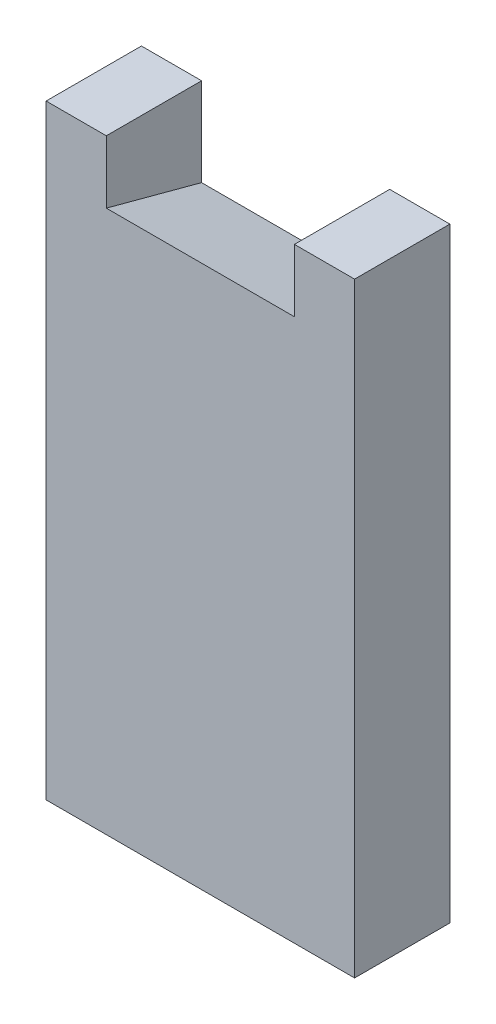
ISO-10303-21;
HEADER;
FILE_DESCRIPTION(('STEP AP214'),'2;1');
FILE_NAME('part.step','',(''),(''),'','','');
FILE_SCHEMA(('AUTOMOTIVE_DESIGN { 1 0 10303 214 1 1 1 1 }'));
ENDSEC;
DATA;
#1=APPLICATION_CONTEXT('core data for automotive mechanical design processes');
#2=APPLICATION_PROTOCOL_DEFINITION('international standard','automotive_design',2000,#1);
#3=PRODUCT_CONTEXT('',#1,'mechanical');
#4=PRODUCT('Part','Part','',(#3));
#5=PRODUCT_RELATED_PRODUCT_CATEGORY('part','',(#4));
#6=PRODUCT_DEFINITION_FORMATION('','',#4);
#7=PRODUCT_DEFINITION_CONTEXT('part definition',#1,'design');
#8=PRODUCT_DEFINITION('design','',#6,#7);
#9=PRODUCT_DEFINITION_SHAPE('','',#8);
#10=(LENGTH_UNIT() NAMED_UNIT(*) SI_UNIT(.MILLI.,.METRE.));
#11=(NAMED_UNIT(*) PLANE_ANGLE_UNIT() SI_UNIT($,.RADIAN.));
#12=(NAMED_UNIT(*) SI_UNIT($,.STERADIAN.) SOLID_ANGLE_UNIT());
#13=UNCERTAINTY_MEASURE_WITH_UNIT(LENGTH_MEASURE(1.E-05),#10,'distance_accuracy_value','');
#14=(GEOMETRIC_REPRESENTATION_CONTEXT(3) GLOBAL_UNCERTAINTY_ASSIGNED_CONTEXT((#13)) GLOBAL_UNIT_ASSIGNED_CONTEXT((#10,
#11,#12)) REPRESENTATION_CONTEXT('',''));
#15=CARTESIAN_POINT('',(0.,0.,0.));
#16=DIRECTION('',(0.,0.,1.));
#17=DIRECTION('',(1.,0.,0.));
#18=AXIS2_PLACEMENT_3D('',#15,#16,#17);
#19=CARTESIAN_POINT('',(0.,0.,7.6));
#20=DIRECTION('',(0.,1.,0.));
#21=DIRECTION('',(-1.,0.,0.));
#22=AXIS2_PLACEMENT_3D('',#19,#20,#21);
#23=PLANE('',#22);
#24=DIRECTION('',(1.,0.,0.));
#25=VECTOR('',#24,1.);
#26=CARTESIAN_POINT('',(0.,0.,0.));
#27=LINE('',#26,#25);
#28=CARTESIAN_POINT('',(19.8,0.,0.));
#29=VERTEX_POINT('',#28);
#30=CARTESIAN_POINT('',(24.6,0.,0.));
#31=VERTEX_POINT('',#30);
#32=EDGE_CURVE('E117',#29,#31,#27,.T.);
#33=ORIENTED_EDGE('',*,*,#32,.F.);
#34=DIRECTION('',(0.,0.,-1.));
#35=VECTOR('',#34,1.);
#36=CARTESIAN_POINT('',(19.8,0.,7.6));
#37=LINE('',#36,#35);
#38=CARTESIAN_POINT('',(19.8,0.,7.6));
#39=VERTEX_POINT('',#38);
#40=EDGE_CURVE('E11',#39,#29,#37,.T.);
#41=ORIENTED_EDGE('',*,*,#40,.F.);
#42=DIRECTION('',(1.,0.,0.));
#43=VECTOR('',#42,1.);
#44=CARTESIAN_POINT('',(0.,0.,7.6));
#45=LINE('',#44,#43);
#46=CARTESIAN_POINT('',(24.6,0.,7.6));
#47=VERTEX_POINT('',#46);
#48=EDGE_CURVE('E127',#39,#47,#45,.T.);
#49=ORIENTED_EDGE('',*,*,#48,.T.);
#50=DIRECTION('',(0.,0.,-1.));
#51=VECTOR('',#50,1.);
#52=CARTESIAN_POINT('',(24.6,0.,7.6));
#53=LINE('',#52,#51);
#54=EDGE_CURVE('E58',#47,#31,#53,.T.);
#55=ORIENTED_EDGE('',*,*,#54,.T.);
#56=EDGE_LOOP('',(#33,#41,#49,#55));
#57=FACE_BOUND('',#56,.T.);
#58=ADVANCED_FACE('F39',(#57),#23,.T.);
#59=CARTESIAN_POINT('',(19.8,0.,7.6));
#60=DIRECTION('',(1.,0.,0.));
#61=DIRECTION('',(0.,0.,-1.));
#62=AXIS2_PLACEMENT_3D('',#59,#60,#61);
#63=PLANE('',#62);
#64=DIRECTION('',(0.,-1.,0.));
#65=VECTOR('',#64,1.);
#66=CARTESIAN_POINT('',(19.8,0.,0.));
#67=LINE('',#66,#65);
#68=CARTESIAN_POINT('',(19.8,-7.03641386247654,0.));
#69=VERTEX_POINT('',#68);
#70=EDGE_CURVE('E107',#29,#69,#67,.T.);
#71=ORIENTED_EDGE('',*,*,#70,.T.);
#72=DIRECTION('',(0.,-0.258819045102521,-0.965925826289068));
#73=VECTOR('',#72,1.);
#74=CARTESIAN_POINT('',(19.8,-5.,7.6));
#75=LINE('',#74,#73);
#76=CARTESIAN_POINT('',(19.8,-5.,7.6));
#77=VERTEX_POINT('',#76);
#78=EDGE_CURVE('E49',#77,#69,#75,.T.);
#79=ORIENTED_EDGE('',*,*,#78,.F.);
#80=DIRECTION('',(0.,-1.,0.));
#81=VECTOR('',#80,1.);
#82=CARTESIAN_POINT('',(19.8,0.,7.6));
#83=LINE('',#82,#81);
#84=EDGE_CURVE('E155',#39,#77,#83,.T.);
#85=ORIENTED_EDGE('',*,*,#84,.F.);
#86=ORIENTED_EDGE('',*,*,#40,.T.);
#87=EDGE_LOOP('',(#71,#79,#85,#86));
#88=FACE_BOUND('',#87,.T.);
#89=ADVANCED_FACE('F164',(#88),#63,.F.);
#90=CARTESIAN_POINT('',(0.,-5.,7.6));
#91=DIRECTION('',(0.,0.965925826289068,-0.258819045102521));
#92=DIRECTION('',(0.,0.258819045102521,0.965925826289068));
#93=AXIS2_PLACEMENT_3D('',#90,#91,#92);
#94=PLANE('',#93);
#95=DIRECTION('',(1.,0.,0.));
#96=VECTOR('',#95,1.);
#97=CARTESIAN_POINT('',(0.,-7.03641386247654,0.));
#98=LINE('',#97,#96);
#99=CARTESIAN_POINT('',(4.8,-7.03641386247654,0.));
#100=VERTEX_POINT('',#99);
#101=EDGE_CURVE('E104',#100,#69,#98,.T.);
#102=ORIENTED_EDGE('',*,*,#101,.F.);
#103=DIRECTION('',(0.,-0.258819045102521,-0.965925826289068));
#104=VECTOR('',#103,1.);
#105=CARTESIAN_POINT('',(4.8,-5.,7.6));
#106=LINE('',#105,#104);
#107=CARTESIAN_POINT('',(4.8,-5.,7.6));
#108=VERTEX_POINT('',#107);
#109=EDGE_CURVE('E43',#108,#100,#106,.T.);
#110=ORIENTED_EDGE('',*,*,#109,.F.);
#111=DIRECTION('',(1.,0.,0.));
#112=VECTOR('',#111,1.);
#113=CARTESIAN_POINT('',(0.,-5.,7.6));
#114=LINE('',#113,#112);
#115=EDGE_CURVE('E151',#108,#77,#114,.T.);
#116=ORIENTED_EDGE('',*,*,#115,.T.);
#117=ORIENTED_EDGE('',*,*,#78,.T.);
#118=EDGE_LOOP('',(#102,#110,#116,#117));
#119=FACE_BOUND('',#118,.T.);
#120=ADVANCED_FACE('F41',(#119),#94,.T.);
#121=CARTESIAN_POINT('',(4.8,0.,7.6));
#122=DIRECTION('',(1.,0.,0.));
#123=DIRECTION('',(0.,1.,0.));
#124=AXIS2_PLACEMENT_3D('',#121,#122,#123);
#125=PLANE('',#124);
#126=DIRECTION('',(0.,-1.,0.));
#127=VECTOR('',#126,1.);
#128=CARTESIAN_POINT('',(4.8,0.,0.));
#129=LINE('',#128,#127);
#130=CARTESIAN_POINT('',(4.8,0.,0.));
#131=VERTEX_POINT('',#130);
#132=EDGE_CURVE('E96',#131,#100,#129,.T.);
#133=ORIENTED_EDGE('',*,*,#132,.F.);
#134=DIRECTION('',(0.,0.,-1.));
#135=VECTOR('',#134,1.);
#136=CARTESIAN_POINT('',(4.8,0.,7.6));
#137=LINE('',#136,#135);
#138=CARTESIAN_POINT('',(4.8,0.,7.6));
#139=VERTEX_POINT('',#138);
#140=EDGE_CURVE('E102',#139,#131,#137,.T.);
#141=ORIENTED_EDGE('',*,*,#140,.F.);
#142=DIRECTION('',(0.,-1.,0.));
#143=VECTOR('',#142,1.);
#144=CARTESIAN_POINT('',(4.8,0.,7.6));
#145=LINE('',#144,#143);
#146=EDGE_CURVE('E100',#139,#108,#145,.T.);
#147=ORIENTED_EDGE('',*,*,#146,.T.);
#148=ORIENTED_EDGE('',*,*,#109,.T.);
#149=EDGE_LOOP('',(#133,#141,#147,#148));
#150=FACE_BOUND('',#149,.T.);
#151=ADVANCED_FACE('F93',(#150),#125,.T.);
#152=CARTESIAN_POINT('',(0.,0.,0.));
#153=VERTEX_POINT('',#152);
#154=EDGE_CURVE('E113',#153,#131,#27,.T.);
#155=ORIENTED_EDGE('',*,*,#154,.F.);
#156=DIRECTION('',(0.,0.,-1.));
#157=VECTOR('',#156,1.);
#158=CARTESIAN_POINT('',(0.,0.,7.6));
#159=LINE('',#158,#157);
#160=CARTESIAN_POINT('',(0.,0.,7.6));
#161=VERTEX_POINT('',#160);
#162=EDGE_CURVE('E135',#161,#153,#159,.T.);
#163=ORIENTED_EDGE('',*,*,#162,.F.);
#164=EDGE_CURVE('E143',#161,#139,#45,.T.);
#165=ORIENTED_EDGE('',*,*,#164,.T.);
#166=ORIENTED_EDGE('',*,*,#140,.T.);
#167=EDGE_LOOP('',(#155,#163,#165,#166));
#168=FACE_BOUND('',#167,.T.);
#169=ADVANCED_FACE('F139',(#168),#23,.T.);
#170=CARTESIAN_POINT('',(0.,0.,7.6));
#171=DIRECTION('',(1.,0.,0.));
#172=DIRECTION('',(0.,1.,0.));
#173=AXIS2_PLACEMENT_3D('',#170,#171,#172);
#174=PLANE('',#173);
#175=DIRECTION('',(0.,-1.,0.));
#176=VECTOR('',#175,1.);
#177=CARTESIAN_POINT('',(0.,0.,0.));
#178=LINE('',#177,#176);
#179=CARTESIAN_POINT('',(0.,-48.27,0.));
#180=VERTEX_POINT('',#179);
#181=EDGE_CURVE('E115',#153,#180,#178,.T.);
#182=ORIENTED_EDGE('',*,*,#181,.T.);
#183=DIRECTION('',(0.,0.,-1.));
#184=VECTOR('',#183,1.);
#185=CARTESIAN_POINT('',(0.,-48.27,7.6));
#186=LINE('',#185,#184);
#187=CARTESIAN_POINT('',(0.,-48.27,7.6));
#188=VERTEX_POINT('',#187);
#189=EDGE_CURVE('E132',#188,#180,#186,.T.);
#190=ORIENTED_EDGE('',*,*,#189,.F.);
#191=DIRECTION('',(0.,-1.,0.));
#192=VECTOR('',#191,1.);
#193=CARTESIAN_POINT('',(0.,0.,7.6));
#194=LINE('',#193,#192);
#195=EDGE_CURVE('E153',#161,#188,#194,.T.);
#196=ORIENTED_EDGE('',*,*,#195,.F.);
#197=ORIENTED_EDGE('',*,*,#162,.T.);
#198=EDGE_LOOP('',(#182,#190,#196,#197));
#199=FACE_BOUND('',#198,.T.);
#200=ADVANCED_FACE('F178',(#199),#174,.F.);
#201=CARTESIAN_POINT('',(0.,-48.27,7.6));
#202=DIRECTION('',(0.,1.,0.));
#203=DIRECTION('',(0.,0.,1.));
#204=AXIS2_PLACEMENT_3D('',#201,#202,#203);
#205=PLANE('',#204);
#206=DIRECTION('',(1.,0.,0.));
#207=VECTOR('',#206,1.);
#208=CARTESIAN_POINT('',(0.,-48.27,0.));
#209=LINE('',#208,#207);
#210=CARTESIAN_POINT('',(24.6,-48.27,0.));
#211=VERTEX_POINT('',#210);
#212=EDGE_CURVE('E121',#180,#211,#209,.T.);
#213=ORIENTED_EDGE('',*,*,#212,.T.);
#214=DIRECTION('',(0.,0.,-1.));
#215=VECTOR('',#214,1.);
#216=CARTESIAN_POINT('',(24.6,-48.27,7.6));
#217=LINE('',#216,#215);
#218=CARTESIAN_POINT('',(24.6,-48.27,7.6));
#219=VERTEX_POINT('',#218);
#220=EDGE_CURVE('E129',#219,#211,#217,.T.);
#221=ORIENTED_EDGE('',*,*,#220,.F.);
#222=DIRECTION('',(1.,0.,0.));
#223=VECTOR('',#222,1.);
#224=CARTESIAN_POINT('',(0.,-48.27,7.6));
#225=LINE('',#224,#223);
#226=EDGE_CURVE('E160',#188,#219,#225,.T.);
#227=ORIENTED_EDGE('',*,*,#226,.F.);
#228=ORIENTED_EDGE('',*,*,#189,.T.);
#229=EDGE_LOOP('',(#213,#221,#227,#228));
#230=FACE_BOUND('',#229,.T.);
#231=ADVANCED_FACE('F175',(#230),#205,.F.);
#232=CARTESIAN_POINT('',(24.6,0.,7.6));
#233=DIRECTION('',(1.,0.,0.));
#234=DIRECTION('',(0.,1.,0.));
#235=AXIS2_PLACEMENT_3D('',#232,#233,#234);
#236=PLANE('',#235);
#237=DIRECTION('',(0.,-1.,0.));
#238=VECTOR('',#237,1.);
#239=CARTESIAN_POINT('',(24.6,0.,0.));
#240=LINE('',#239,#238);
#241=EDGE_CURVE('E124',#31,#211,#240,.T.);
#242=ORIENTED_EDGE('',*,*,#241,.F.);
#243=ORIENTED_EDGE('',*,*,#54,.F.);
#244=DIRECTION('',(0.,-1.,0.));
#245=VECTOR('',#244,1.);
#246=CARTESIAN_POINT('',(24.6,0.,7.6));
#247=LINE('',#246,#245);
#248=EDGE_CURVE('E130',#47,#219,#247,.T.);
#249=ORIENTED_EDGE('',*,*,#248,.T.);
#250=ORIENTED_EDGE('',*,*,#220,.T.);
#251=EDGE_LOOP('',(#242,#243,#249,#250));
#252=FACE_BOUND('',#251,.T.);
#253=ADVANCED_FACE('F172',(#252),#236,.T.);
#254=CARTESIAN_POINT('',(0.,0.,7.6));
#255=DIRECTION('',(0.,0.,1.));
#256=DIRECTION('',(1.,0.,0.));
#257=AXIS2_PLACEMENT_3D('',#254,#255,#256);
#258=PLANE('',#257);
#259=ORIENTED_EDGE('',*,*,#48,.F.);
#260=ORIENTED_EDGE('',*,*,#84,.T.);
#261=ORIENTED_EDGE('',*,*,#115,.F.);
#262=ORIENTED_EDGE('',*,*,#146,.F.);
#263=ORIENTED_EDGE('',*,*,#164,.F.);
#264=ORIENTED_EDGE('',*,*,#195,.T.);
#265=ORIENTED_EDGE('',*,*,#226,.T.);
#266=ORIENTED_EDGE('',*,*,#248,.F.);
#267=EDGE_LOOP('',(#259,#260,#261,#262,#263,#264,#265,#266));
#268=FACE_BOUND('',#267,.T.);
#269=ADVANCED_FACE('F148',(#268),#258,.T.);
#270=CARTESIAN_POINT('',(0.,0.,0.));
#271=DIRECTION('',(0.,0.,1.));
#272=DIRECTION('',(1.,0.,0.));
#273=AXIS2_PLACEMENT_3D('',#270,#271,#272);
#274=PLANE('',#273);
#275=ORIENTED_EDGE('',*,*,#32,.T.);
#276=ORIENTED_EDGE('',*,*,#241,.T.);
#277=ORIENTED_EDGE('',*,*,#212,.F.);
#278=ORIENTED_EDGE('',*,*,#181,.F.);
#279=ORIENTED_EDGE('',*,*,#154,.T.);
#280=ORIENTED_EDGE('',*,*,#132,.T.);
#281=ORIENTED_EDGE('',*,*,#101,.T.);
#282=ORIENTED_EDGE('',*,*,#70,.F.);
#283=EDGE_LOOP('',(#275,#276,#277,#278,#279,#280,#281,#282));
#284=FACE_BOUND('',#283,.T.);
#285=ADVANCED_FACE('F110',(#284),#274,.F.);
#286=CLOSED_SHELL('',(#58,#89,#120,#151,#169,#200,#231,#253,#269,#285));
#287=MANIFOLD_SOLID_BREP('B2',#286);
#288=ADVANCED_BREP_SHAPE_REPRESENTATION('',(#18,#287),#14);
#289=SHAPE_DEFINITION_REPRESENTATION(#9,#288);
ENDSEC;
END-ISO-10303-21;
